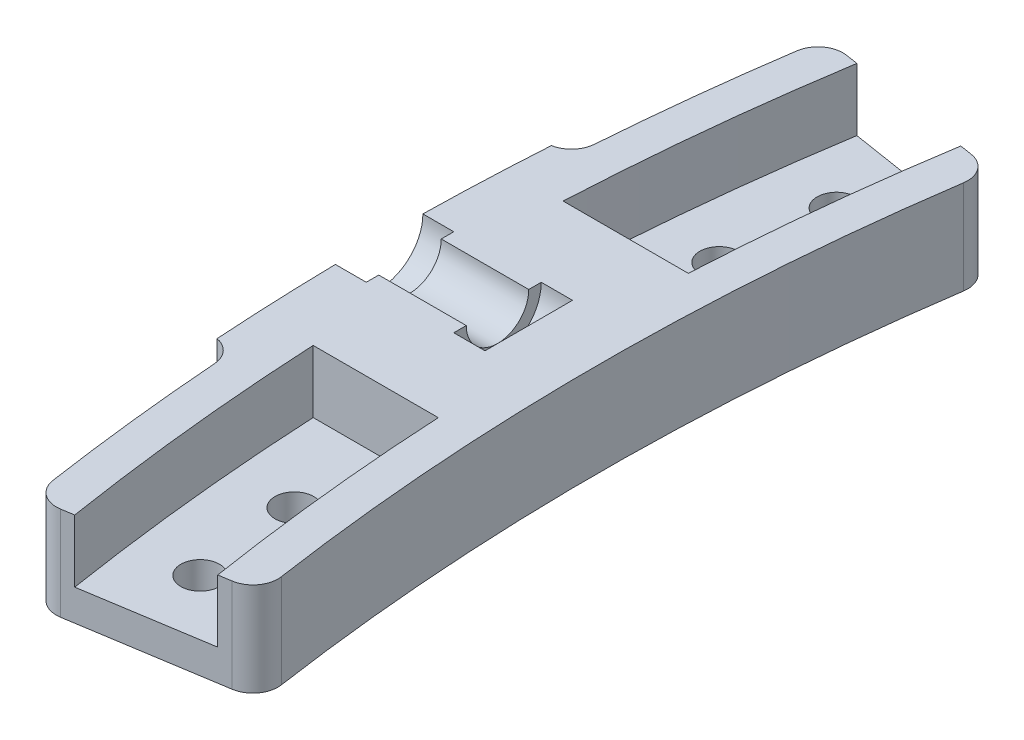
ISO-10303-21;
HEADER;
FILE_DESCRIPTION(('STEP AP214'),'2;1');
FILE_NAME('part.step','',(''),(''),'','','');
FILE_SCHEMA(('AUTOMOTIVE_DESIGN { 1 0 10303 214 1 1 1 1 }'));
ENDSEC;
DATA;
#1=APPLICATION_CONTEXT('core data for automotive mechanical design processes');
#2=APPLICATION_PROTOCOL_DEFINITION('international standard','automotive_design',2000,#1);
#3=PRODUCT_CONTEXT('',#1,'mechanical');
#4=PRODUCT('Part','Part','',(#3));
#5=PRODUCT_RELATED_PRODUCT_CATEGORY('part','',(#4));
#6=PRODUCT_DEFINITION_FORMATION('','',#4);
#7=PRODUCT_DEFINITION_CONTEXT('part definition',#1,'design');
#8=PRODUCT_DEFINITION('design','',#6,#7);
#9=PRODUCT_DEFINITION_SHAPE('','',#8);
#10=(LENGTH_UNIT() NAMED_UNIT(*) SI_UNIT(.MILLI.,.METRE.));
#11=(NAMED_UNIT(*) PLANE_ANGLE_UNIT() SI_UNIT($,.RADIAN.));
#12=(NAMED_UNIT(*) SI_UNIT($,.STERADIAN.) SOLID_ANGLE_UNIT());
#13=UNCERTAINTY_MEASURE_WITH_UNIT(LENGTH_MEASURE(1.E-05),#10,'distance_accuracy_value','');
#14=(GEOMETRIC_REPRESENTATION_CONTEXT(3) GLOBAL_UNCERTAINTY_ASSIGNED_CONTEXT((#13)) GLOBAL_UNIT_ASSIGNED_CONTEXT((#10,
#11,#12)) REPRESENTATION_CONTEXT('',''));
#15=CARTESIAN_POINT('',(0.,0.,0.));
#16=DIRECTION('',(0.,0.,1.));
#17=DIRECTION('',(1.,0.,0.));
#18=AXIS2_PLACEMENT_3D('',#15,#16,#17);
#19=CARTESIAN_POINT('',(0.,7.5,0.));
#20=DIRECTION('',(0.,1.,0.));
#21=DIRECTION('',(0.,0.,1.));
#22=AXIS2_PLACEMENT_3D('',#19,#20,#21);
#23=PLANE('',#22);
#24=DIRECTION('',(0.987688340595138,0.,0.156434465040232));
#25=VECTOR('',#24,1.);
#26=CARTESIAN_POINT('',(0.,7.5,0.));
#27=LINE('',#26,#25);
#28=CARTESIAN_POINT('',(-198.515528471673,7.5,-31.4417708727157));
#29=VERTEX_POINT('',#28);
#30=CARTESIAN_POINT('',(-197.537668119028,7.5,-31.2868930080464));
#31=VERTEX_POINT('',#30);
#32=EDGE_CURVE('E534',#29,#31,#27,.T.);
#33=ORIENTED_EDGE('',*,*,#32,.F.);
#34=CARTESIAN_POINT('',(-198.828397401754,7.5,-29.4663941915254));
#35=DIRECTION('',(0.,1.,0.));
#36=DIRECTION('',(0.,0.,1.));
#37=AXIS2_PLACEMENT_3D('',#34,#35,#36);
#38=CIRCLE('',#37,2.);
#39=CARTESIAN_POINT('',(-200.806789415701,7.5,-29.7595921436799));
#40=VERTEX_POINT('',#39);
#41=EDGE_CURVE('E394',#29,#40,#38,.T.);
#42=ORIENTED_EDGE('',*,*,#41,.T.);
#43=CARTESIAN_POINT('',(0.,7.5,0.));
#44=DIRECTION('',(0.,1.,0.));
#45=DIRECTION('',(0.,0.,1.));
#46=AXIS2_PLACEMENT_3D('',#43,#44,#45);
#47=CIRCLE('',#46,203.);
#48=CARTESIAN_POINT('',(-202.430732799715,7.5,-15.1920511508636));
#49=VERTEX_POINT('',#48);
#50=EDGE_CURVE('E537',#40,#49,#47,.T.);
#51=ORIENTED_EDGE('',*,*,#50,.T.);
#52=CARTESIAN_POINT('',(-204.42512425587,7.5,-15.3417265316603));
#53=DIRECTION('',(0.,1.,0.));
#54=DIRECTION('',(0.,0.,1.));
#55=AXIS2_PLACEMENT_3D('',#52,#53,#54);
#56=CIRCLE('',#55,2.);
#57=CARTESIAN_POINT('',(-204.062149802294,7.5,-13.3749399275643));
#58=VERTEX_POINT('',#57);
#59=EDGE_CURVE('E367',#49,#58,#56,.F.);
#60=ORIENTED_EDGE('',*,*,#59,.T.);
#61=CARTESIAN_POINT('',(0.,7.5,0.));
#62=DIRECTION('',(0.,1.,0.));
#63=DIRECTION('',(0.,0.,1.));
#64=AXIS2_PLACEMENT_3D('',#61,#62,#63);
#65=CIRCLE('',#64,204.5);
#66=CARTESIAN_POINT('',(-204.470046706113,7.5,-3.50000000000005));
#67=VERTEX_POINT('',#66);
#68=EDGE_CURVE('E430',#58,#67,#65,.T.);
#69=ORIENTED_EDGE('',*,*,#68,.T.);
#70=DIRECTION('',(-1.,0.,0.));
#71=VECTOR('',#70,1.);
#72=CARTESIAN_POINT('',(-202.,7.5,-3.50000000000005));
#73=LINE('',#72,#71);
#74=CARTESIAN_POINT('',(-202.,7.5,-3.50000000000005));
#75=VERTEX_POINT('',#74);
#76=EDGE_CURVE('E426',#67,#75,#73,.F.);
#77=ORIENTED_EDGE('',*,*,#76,.T.);
#78=DIRECTION('',(0.,0.,-1.));
#79=VECTOR('',#78,1.);
#80=CARTESIAN_POINT('',(-202.,7.5,0.));
#81=LINE('',#80,#79);
#82=CARTESIAN_POINT('',(-202.,7.5,-2.50000000000005));
#83=VERTEX_POINT('',#82);
#84=EDGE_CURVE('E222',#83,#75,#81,.T.);
#85=ORIENTED_EDGE('',*,*,#84,.F.);
#86=DIRECTION('',(1.,0.,0.));
#87=VECTOR('',#86,1.);
#88=CARTESIAN_POINT('',(-204.5,7.5,-2.50000000000005));
#89=LINE('',#88,#87);
#90=CARTESIAN_POINT('',(-195.,7.5,-2.50000000000005));
#91=VERTEX_POINT('',#90);
#92=EDGE_CURVE('E208',#91,#83,#89,.F.);
#93=ORIENTED_EDGE('',*,*,#92,.F.);
#94=DIRECTION('',(0.,0.,-1.));
#95=VECTOR('',#94,1.);
#96=CARTESIAN_POINT('',(-195.,7.5,0.));
#97=LINE('',#96,#95);
#98=CARTESIAN_POINT('',(-195.,7.5,-3.50000000000005));
#99=VERTEX_POINT('',#98);
#100=EDGE_CURVE('E219',#91,#99,#97,.T.);
#101=ORIENTED_EDGE('',*,*,#100,.T.);
#102=DIRECTION('',(1.,0.,0.));
#103=VECTOR('',#102,1.);
#104=CARTESIAN_POINT('',(-195.,7.5,-3.50000000000005));
#105=LINE('',#104,#103);
#106=CARTESIAN_POINT('',(-192.5,7.5,-3.50000000000005));
#107=VERTEX_POINT('',#106);
#108=EDGE_CURVE('E233',#107,#99,#105,.F.);
#109=ORIENTED_EDGE('',*,*,#108,.F.);
#110=DIRECTION('',(0.,0.,-1.));
#111=VECTOR('',#110,1.);
#112=CARTESIAN_POINT('',(-192.5,7.5,0.));
#113=LINE('',#112,#111);
#114=CARTESIAN_POINT('',(-192.5,7.5,3.49999999999995));
#115=VERTEX_POINT('',#114);
#116=EDGE_CURVE('E539',#115,#107,#113,.T.);
#117=ORIENTED_EDGE('',*,*,#116,.F.);
#118=DIRECTION('',(1.,0.,0.));
#119=VECTOR('',#118,1.);
#120=CARTESIAN_POINT('',(-195.,7.5,3.49999999999995));
#121=LINE('',#120,#119);
#122=CARTESIAN_POINT('',(-195.,7.5,3.49999999999995));
#123=VERTEX_POINT('',#122);
#124=EDGE_CURVE('E229',#123,#115,#121,.T.);
#125=ORIENTED_EDGE('',*,*,#124,.F.);
#126=CARTESIAN_POINT('',(-195.,7.5,2.49999999999995));
#127=VERTEX_POINT('',#126);
#128=EDGE_CURVE('E228',#123,#127,#97,.T.);
#129=ORIENTED_EDGE('',*,*,#128,.T.);
#130=DIRECTION('',(1.,0.,0.));
#131=VECTOR('',#130,1.);
#132=CARTESIAN_POINT('',(-204.5,7.5,2.49999999999995));
#133=LINE('',#132,#131);
#134=CARTESIAN_POINT('',(-202.,7.5,2.49999999999995));
#135=VERTEX_POINT('',#134);
#136=EDGE_CURVE('E211',#135,#127,#133,.T.);
#137=ORIENTED_EDGE('',*,*,#136,.F.);
#138=CARTESIAN_POINT('',(-202.,7.5,3.49999999999995));
#139=VERTEX_POINT('',#138);
#140=EDGE_CURVE('E244',#139,#135,#81,.T.);
#141=ORIENTED_EDGE('',*,*,#140,.F.);
#142=DIRECTION('',(-1.,0.,0.));
#143=VECTOR('',#142,1.);
#144=CARTESIAN_POINT('',(-202.,7.5,3.49999999999995));
#145=LINE('',#144,#143);
#146=CARTESIAN_POINT('',(-204.470046706113,7.5,3.49999999999995));
#147=VERTEX_POINT('',#146);
#148=EDGE_CURVE('E428',#139,#147,#145,.T.);
#149=ORIENTED_EDGE('',*,*,#148,.T.);
#150=CARTESIAN_POINT('',(-204.062149802294,7.5,13.3749399275643));
#151=VERTEX_POINT('',#150);
#152=EDGE_CURVE('E520',#147,#151,#65,.T.);
#153=ORIENTED_EDGE('',*,*,#152,.T.);
#154=CARTESIAN_POINT('',(-204.42512425587,7.5,15.3417265316613));
#155=DIRECTION('',(0.,1.,0.));
#156=DIRECTION('',(0.,0.,1.));
#157=AXIS2_PLACEMENT_3D('',#154,#155,#156);
#158=CIRCLE('',#157,2.);
#159=CARTESIAN_POINT('',(-202.430732799715,7.5,15.1920511508646));
#160=VERTEX_POINT('',#159);
#161=EDGE_CURVE('E11',#151,#160,#158,.F.);
#162=ORIENTED_EDGE('',*,*,#161,.T.);
#163=CARTESIAN_POINT('',(-200.806789415701,7.5,29.7595921436798));
#164=VERTEX_POINT('',#163);
#165=EDGE_CURVE('E536',#160,#164,#47,.T.);
#166=ORIENTED_EDGE('',*,*,#165,.T.);
#167=CARTESIAN_POINT('',(-198.828397401754,7.5,29.4663941915253));
#168=DIRECTION('',(0.,1.,0.));
#169=DIRECTION('',(0.,0.,1.));
#170=AXIS2_PLACEMENT_3D('',#167,#168,#169);
#171=CIRCLE('',#170,2.);
#172=CARTESIAN_POINT('',(-198.515528471673,7.5,31.4417708727156));
#173=VERTEX_POINT('',#172);
#174=EDGE_CURVE('E400',#164,#173,#171,.T.);
#175=ORIENTED_EDGE('',*,*,#174,.T.);
#176=DIRECTION('',(-0.987688340595138,0.,0.156434465040231));
#177=VECTOR('',#176,1.);
#178=CARTESIAN_POINT('',(0.,7.5,0.));
#179=LINE('',#178,#177);
#180=CARTESIAN_POINT('',(-197.537668119028,7.5,31.2868930080463));
#181=VERTEX_POINT('',#180);
#182=EDGE_CURVE('E530',#181,#173,#179,.T.);
#183=ORIENTED_EDGE('',*,*,#182,.F.);
#184=CARTESIAN_POINT('',(0.,7.5,0.));
#185=DIRECTION('',(0.,1.,0.));
#186=DIRECTION('',(0.,0.,1.));
#187=AXIS2_PLACEMENT_3D('',#184,#185,#186);
#188=CIRCLE('',#187,200.);
#189=CARTESIAN_POINT('',(-199.749843554382,7.5,10.));
#190=VERTEX_POINT('',#189);
#191=EDGE_CURVE('E506',#190,#181,#188,.T.);
#192=ORIENTED_EDGE('',*,*,#191,.F.);
#193=DIRECTION('',(-1.,0.,0.));
#194=VECTOR('',#193,1.);
#195=CARTESIAN_POINT('',(0.,7.5,10.));
#196=LINE('',#195,#194);
#197=CARTESIAN_POINT('',(-189.736659610103,7.5,10.));
#198=VERTEX_POINT('',#197);
#199=EDGE_CURVE('E460',#198,#190,#196,.T.);
#200=ORIENTED_EDGE('',*,*,#199,.F.);
#201=CARTESIAN_POINT('',(0.,7.5,0.));
#202=DIRECTION('',(0.,1.,0.));
#203=DIRECTION('',(0.,0.,1.));
#204=AXIS2_PLACEMENT_3D('',#201,#202,#203);
#205=CIRCLE('',#204,190.);
#206=CARTESIAN_POINT('',(-187.660784713076,7.5,29.7225483576439));
#207=VERTEX_POINT('',#206);
#208=EDGE_CURVE('E496',#198,#207,#205,.T.);
#209=ORIENTED_EDGE('',*,*,#208,.T.);
#210=CARTESIAN_POINT('',(-186.662644351399,7.5,29.5644584550944));
#211=VERTEX_POINT('',#210);
#212=EDGE_CURVE('E527',#211,#207,#179,.T.);
#213=ORIENTED_EDGE('',*,*,#212,.F.);
#214=CARTESIAN_POINT('',(-186.97551328148,7.5,27.5890817739042));
#215=DIRECTION('',(0.,1.,0.));
#216=DIRECTION('',(0.,0.,1.));
#217=AXIS2_PLACEMENT_3D('',#214,#215,#216);
#218=CIRCLE('',#217,2.);
#219=CARTESIAN_POINT('',(-184.996936421358,7.5,27.2971338186247));
#220=VERTEX_POINT('',#219);
#221=EDGE_CURVE('E398',#211,#220,#218,.T.);
#222=ORIENTED_EDGE('',*,*,#221,.T.);
#223=CARTESIAN_POINT('',(0.,7.5,0.));
#224=DIRECTION('',(0.,1.,0.));
#225=DIRECTION('',(0.,0.,1.));
#226=AXIS2_PLACEMENT_3D('',#223,#224,#225);
#227=CIRCLE('',#226,187.);
#228=CARTESIAN_POINT('',(-184.996936421358,7.5,-27.2971338186249));
#229=VERTEX_POINT('',#228);
#230=EDGE_CURVE('E529',#229,#220,#227,.T.);
#231=ORIENTED_EDGE('',*,*,#230,.F.);
#232=CARTESIAN_POINT('',(-186.97551328148,7.5,-27.5890817739043));
#233=DIRECTION('',(0.,1.,0.));
#234=DIRECTION('',(0.,0.,1.));
#235=AXIS2_PLACEMENT_3D('',#232,#233,#234);
#236=CIRCLE('',#235,2.);
#237=CARTESIAN_POINT('',(-186.662644351399,7.5,-29.5644584550946));
#238=VERTEX_POINT('',#237);
#239=EDGE_CURVE('E396',#229,#238,#236,.T.);
#240=ORIENTED_EDGE('',*,*,#239,.T.);
#241=CARTESIAN_POINT('',(-187.660784713076,7.5,-29.7225483576441));
#242=VERTEX_POINT('',#241);
#243=EDGE_CURVE('E533',#242,#238,#27,.T.);
#244=ORIENTED_EDGE('',*,*,#243,.F.);
#245=CARTESIAN_POINT('',(0.,7.5,0.));
#246=DIRECTION('',(0.,1.,0.));
#247=DIRECTION('',(0.,0.,1.));
#248=AXIS2_PLACEMENT_3D('',#245,#246,#247);
#249=CIRCLE('',#248,190.);
#250=CARTESIAN_POINT('',(-189.736659610103,7.5,-9.99999999999999));
#251=VERTEX_POINT('',#250);
#252=EDGE_CURVE('E465',#242,#251,#249,.T.);
#253=ORIENTED_EDGE('',*,*,#252,.T.);
#254=DIRECTION('',(-1.,0.,0.));
#255=VECTOR('',#254,1.);
#256=CARTESIAN_POINT('',(0.,7.5,-10.));
#257=LINE('',#256,#255);
#258=CARTESIAN_POINT('',(-199.749843554382,7.5,-9.99999999999999));
#259=VERTEX_POINT('',#258);
#260=EDGE_CURVE('E476',#251,#259,#257,.T.);
#261=ORIENTED_EDGE('',*,*,#260,.T.);
#262=CARTESIAN_POINT('',(0.,7.5,0.));
#263=DIRECTION('',(0.,1.,0.));
#264=DIRECTION('',(0.,0.,1.));
#265=AXIS2_PLACEMENT_3D('',#262,#263,#264);
#266=CIRCLE('',#265,200.);
#267=EDGE_CURVE('E473',#31,#259,#266,.T.);
#268=ORIENTED_EDGE('',*,*,#267,.F.);
#269=EDGE_LOOP('',(#33,#42,#51,#60,#69,#77,#85,#93,#101,#109,#117,#125,#129,#137,#141,#149,#153,
#162,#166,#175,#183,#192,#200,#209,#213,#222,#231,#240,#244,#253,#261,#268));
#270=FACE_BOUND('',#269,.T.);
#271=ADVANCED_FACE('F35',(#270),#23,.T.);
#272=CARTESIAN_POINT('',(0.,7.5,0.));
#273=DIRECTION('',(0.,-1.,0.));
#274=DIRECTION('',(0.,0.,-1.));
#275=AXIS2_PLACEMENT_3D('',#272,#273,#274);
#276=CYLINDRICAL_SURFACE('',#275,204.5);
#277=CARTESIAN_POINT('',(-204.470046706113,7.5,-3.50000000000005));
#278=CARTESIAN_POINT('',(-204.470046015007,7.40156709085116,-3.50000943880891));
#279=CARTESIAN_POINT('',(-204.470117770848,7.3031386646568,-3.49584758938259));
#280=CARTESIAN_POINT('',(-204.470401073582,7.10698614676135,-3.47925436424628));
#281=CARTESIAN_POINT('',(-204.470612613706,7.0092620211873,-3.46682338895473));
#282=CARTESIAN_POINT('',(-204.471170185432,6.81527257182049,-3.43377666337935));
#283=CARTESIAN_POINT('',(-204.471516121615,6.71900626325566,-3.41316671989991));
#284=CARTESIAN_POINT('',(-204.472332063616,6.52857582386149,-3.36392937343361));
#285=CARTESIAN_POINT('',(-204.47280206794,6.43441166774297,-3.33530206695291));
#286=CARTESIAN_POINT('',(-204.474380018944,6.15598448276347,-3.23762675794605));
#287=CARTESIAN_POINT('',(-204.475656157778,5.97570405684611,-3.15677120548821));
#288=CARTESIAN_POINT('',(-204.478512008007,5.63141229218133,-2.96600108409679));
#289=CARTESIAN_POINT('',(-204.480091660416,5.46739780167807,-2.85609215985401));
#290=CARTESIAN_POINT('',(-204.483377091486,5.16010021526627,-2.61028016583723));
#291=CARTESIAN_POINT('',(-204.485082884414,5.01681946973034,-2.47437415308749));
#292=CARTESIAN_POINT('',(-204.488428368234,4.75509231999566,-2.18041839537237));
#293=CARTESIAN_POINT('',(-204.49006804902,4.63664970091344,-2.02236528149283));
#294=CARTESIAN_POINT('',(-204.493096216476,4.42797730159888,-1.68861132589826));
#295=CARTESIAN_POINT('',(-204.49448469881,4.33774800826972,-1.51291017968411));
#296=CARTESIAN_POINT('',(-204.496853800962,4.18807499228072,-1.14886219597997));
#297=CARTESIAN_POINT('',(-204.497834447116,4.12862928178693,-0.960516175913655));
#298=CARTESIAN_POINT('',(-204.499277386115,4.04220620697506,-0.576530368187154));
#299=CARTESIAN_POINT('',(-204.499739719827,4.01522628293847,-0.380891156802305));
#300=CARTESIAN_POINT('',(-204.500094053087,3.99449287351828,0.0121449996524284));
#301=CARTESIAN_POINT('',(-204.499986039929,4.00074012837864,0.209541983784637));
#302=CARTESIAN_POINT('',(-204.499211873441,4.04628253942889,0.600461854794114));
#303=CARTESIAN_POINT('',(-204.498545784139,4.0855739044305,0.793985183492657));
#304=CARTESIAN_POINT('',(-204.496730631579,4.19608326672358,1.17168763620416));
#305=CARTESIAN_POINT('',(-204.495581569682,4.26730117390768,1.35586678658787));
#306=CARTESIAN_POINT('',(-204.49292986953,4.43964795573392,1.70966917689119));
#307=CARTESIAN_POINT('',(-204.491427203204,4.54077920512749,1.87929125977886));
#308=CARTESIAN_POINT('',(-204.488237790151,4.77007516054438,2.19914250229239));
#309=CARTESIAN_POINT('',(-204.48655105231,4.89823856202203,2.34937259719317));
#310=CARTESIAN_POINT('',(-204.483183536994,5.17796107182609,2.62618666325573));
#311=CARTESIAN_POINT('',(-204.481502759484,5.32952004154845,2.75277077449529));
#312=CARTESIAN_POINT('',(-204.478336097599,5.65179883449802,2.97873880159179));
#313=CARTESIAN_POINT('',(-204.476850275261,5.82252472493159,3.07811407018099));
#314=CARTESIAN_POINT('',(-204.474240904141,6.17831258593119,3.24683835771934));
#315=CARTESIAN_POINT('',(-204.473117577074,6.36338324471376,3.31616900930716));
#316=CARTESIAN_POINT('',(-204.471362852181,6.74239566531391,3.42266818702435));
#317=CARTESIAN_POINT('',(-204.470730703331,6.93632340174938,3.45988582445775));
#318=CARTESIAN_POINT('',(-204.470267957678,7.19295126295407,3.48705221838691));
#319=CARTESIAN_POINT('',(-204.47018503069,7.25431447039849,3.49191019785082));
#320=CARTESIAN_POINT('',(-204.470074478895,7.37711016371178,3.49837965658393));
#321=CARTESIAN_POINT('',(-204.470046762857,7.43854236717568,3.49999649163529));
#322=CARTESIAN_POINT('',(-204.470046706113,7.5,3.49999999999995));
#323=B_SPLINE_CURVE_WITH_KNOTS('',3,(#277,#278,#279,#280,#281,#282,#283,#284,#285,#286,#287,
#288,#289,#290,#291,#292,#293,#294,#295,#296,#297,#298,#299,#300,#301,#302,#303,#304,#305,#306,
#307,#308,#309,#310,#311,#312,#313,#314,#315,#316,#317,#318,#319,#320,#321,#322),.UNSPECIFIED.,
.F.,.F.,(4,2,2,2,2,2,2,2,2,2,2,2,2,2,2,2,2,2,2,2,2,2,4),(0.,0.29520266530573,0.590391036962056,
0.8853702082295,1.18034582894221,1.77004858658914,2.35963685679118,2.94929191031539,
3.53903675699568,4.12879178088056,4.71850871688937,5.30817915446261,5.89786272892642,
6.48747865755245,7.07709292209594,7.66675400732817,8.25638664259122,8.84601578478512,
9.43583210062764,10.0260084855921,10.6152806898831,10.7998867711548,10.9841875504903),.UNSPECIFIED.);
#324=EDGE_CURVE('E231',#67,#147,#323,.T.);
#325=ORIENTED_EDGE('',*,*,#324,.F.);
#326=ORIENTED_EDGE('',*,*,#68,.F.);
#327=DIRECTION('',(0.,-1.,0.));
#328=VECTOR('',#327,1.);
#329=CARTESIAN_POINT('',(-204.062149802294,7.5,-13.3749399275643));
#330=LINE('',#329,#328);
#331=CARTESIAN_POINT('',(-204.062149802294,0.,-13.3749399275643));
#332=VERTEX_POINT('',#331);
#333=EDGE_CURVE('E370',#58,#332,#330,.T.);
#334=ORIENTED_EDGE('',*,*,#333,.T.);
#335=CARTESIAN_POINT('',(0.,0.,0.));
#336=DIRECTION('',(0.,1.,0.));
#337=DIRECTION('',(0.,0.,1.));
#338=AXIS2_PLACEMENT_3D('',#335,#336,#337);
#339=CIRCLE('',#338,204.5);
#340=CARTESIAN_POINT('',(-204.062149802294,0.,13.3749399275643));
#341=VERTEX_POINT('',#340);
#342=EDGE_CURVE('E485',#332,#341,#339,.T.);
#343=ORIENTED_EDGE('',*,*,#342,.T.);
#344=DIRECTION('',(0.,-1.,0.));
#345=VECTOR('',#344,1.);
#346=CARTESIAN_POINT('',(-204.062149802294,7.5,13.3749399275643));
#347=LINE('',#346,#345);
#348=EDGE_CURVE('E524',#151,#341,#347,.T.);
#349=ORIENTED_EDGE('',*,*,#348,.F.);
#350=ORIENTED_EDGE('',*,*,#152,.F.);
#351=EDGE_LOOP('',(#325,#326,#334,#343,#349,#350));
#352=FACE_BOUND('',#351,.T.);
#353=ADVANCED_FACE('F246',(#352),#276,.T.);
#354=CARTESIAN_POINT('',(0.,7.5,0.));
#355=DIRECTION('',(0.156434465040231,0.,0.987688340595138));
#356=DIRECTION('',(0.987688340595138,0.,-0.156434465040231));
#357=AXIS2_PLACEMENT_3D('',#354,#355,#356);
#358=PLANE('',#357);
#359=DIRECTION('',(-0.987688340595138,0.,0.156434465040231));
#360=VECTOR('',#359,1.);
#361=CARTESIAN_POINT('',(0.,0.,0.));
#362=LINE('',#361,#360);
#363=CARTESIAN_POINT('',(-186.662644351399,0.,29.5644584550944));
#364=VERTEX_POINT('',#363);
#365=CARTESIAN_POINT('',(-198.515528471673,0.,31.4417708727156));
#366=VERTEX_POINT('',#365);
#367=EDGE_CURVE('E526',#364,#366,#362,.T.);
#368=ORIENTED_EDGE('',*,*,#367,.F.);
#369=DIRECTION('',(0.,-1.,0.));
#370=VECTOR('',#369,1.);
#371=CARTESIAN_POINT('',(-186.662644351399,7.5,29.5644584550944));
#372=LINE('',#371,#370);
#373=EDGE_CURVE('E384',#364,#211,#372,.F.);
#374=ORIENTED_EDGE('',*,*,#373,.T.);
#375=ORIENTED_EDGE('',*,*,#212,.T.);
#376=DIRECTION('',(0.,1.,0.));
#377=VECTOR('',#376,1.);
#378=CARTESIAN_POINT('',(-187.660784713076,2.5,29.7225483576439));
#379=LINE('',#378,#377);
#380=CARTESIAN_POINT('',(-187.660784713076,2.5,29.7225483576439));
#381=VERTEX_POINT('',#380);
#382=EDGE_CURVE('E511',#381,#207,#379,.T.);
#383=ORIENTED_EDGE('',*,*,#382,.F.);
#384=DIRECTION('',(0.987688340595138,0.,-0.156434465040231));
#385=VECTOR('',#384,1.);
#386=CARTESIAN_POINT('',(0.,2.5,0.));
#387=LINE('',#386,#385);
#388=CARTESIAN_POINT('',(-197.537668119028,2.5,31.2868930080463));
#389=VERTEX_POINT('',#388);
#390=EDGE_CURVE('E499',#389,#381,#387,.T.);
#391=ORIENTED_EDGE('',*,*,#390,.F.);
#392=DIRECTION('',(0.,1.,0.));
#393=VECTOR('',#392,1.);
#394=CARTESIAN_POINT('',(-197.537668119028,2.5,31.2868930080463));
#395=LINE('',#394,#393);
#396=EDGE_CURVE('E514',#389,#181,#395,.T.);
#397=ORIENTED_EDGE('',*,*,#396,.T.);
#398=ORIENTED_EDGE('',*,*,#182,.T.);
#399=DIRECTION('',(0.,1.,0.));
#400=VECTOR('',#399,1.);
#401=CARTESIAN_POINT('',(-198.515528471673,0.,31.4417708727156));
#402=LINE('',#401,#400);
#403=EDGE_CURVE('E386',#173,#366,#402,.F.);
#404=ORIENTED_EDGE('',*,*,#403,.T.);
#405=EDGE_LOOP('',(#368,#374,#375,#383,#391,#397,#398,#404));
#406=FACE_BOUND('',#405,.T.);
#407=ADVANCED_FACE('F325',(#406),#358,.T.);
#408=CARTESIAN_POINT('',(0.,7.5,0.));
#409=DIRECTION('',(0.156434465040232,0.,-0.987688340595138));
#410=DIRECTION('',(-0.987688340595138,0.,-0.156434465040232));
#411=AXIS2_PLACEMENT_3D('',#408,#409,#410);
#412=PLANE('',#411);
#413=DIRECTION('',(0.987688340595138,0.,0.156434465040232));
#414=VECTOR('',#413,1.);
#415=CARTESIAN_POINT('',(0.,0.,0.));
#416=LINE('',#415,#414);
#417=CARTESIAN_POINT('',(-198.515528471673,0.,-31.4417708727157));
#418=VERTEX_POINT('',#417);
#419=CARTESIAN_POINT('',(-186.662644351399,0.,-29.5644584550946));
#420=VERTEX_POINT('',#419);
#421=EDGE_CURVE('E545',#418,#420,#416,.T.);
#422=ORIENTED_EDGE('',*,*,#421,.F.);
#423=DIRECTION('',(0.,1.,0.));
#424=VECTOR('',#423,1.);
#425=CARTESIAN_POINT('',(-198.515528471673,7.5,-31.4417708727157));
#426=LINE('',#425,#424);
#427=EDGE_CURVE('E402',#418,#29,#426,.T.);
#428=ORIENTED_EDGE('',*,*,#427,.T.);
#429=ORIENTED_EDGE('',*,*,#32,.T.);
#430=DIRECTION('',(0.,1.,0.));
#431=VECTOR('',#430,1.);
#432=CARTESIAN_POINT('',(-197.537668119028,2.5,-31.2868930080464));
#433=LINE('',#432,#431);
#434=CARTESIAN_POINT('',(-197.537668119028,2.5,-31.2868930080464));
#435=VERTEX_POINT('',#434);
#436=EDGE_CURVE('E472',#435,#31,#433,.T.);
#437=ORIENTED_EDGE('',*,*,#436,.F.);
#438=DIRECTION('',(-0.987688340595138,0.,-0.156434465040232));
#439=VECTOR('',#438,1.);
#440=CARTESIAN_POINT('',(0.,2.5,0.));
#441=LINE('',#440,#439);
#442=CARTESIAN_POINT('',(-187.660784713076,2.5,-29.7225483576441));
#443=VERTEX_POINT('',#442);
#444=EDGE_CURVE('E461',#443,#435,#441,.T.);
#445=ORIENTED_EDGE('',*,*,#444,.F.);
#446=DIRECTION('',(0.,1.,0.));
#447=VECTOR('',#446,1.);
#448=CARTESIAN_POINT('',(-187.660784713076,2.5,-29.7225483576441));
#449=LINE('',#448,#447);
#450=EDGE_CURVE('E482',#443,#242,#449,.T.);
#451=ORIENTED_EDGE('',*,*,#450,.T.);
#452=ORIENTED_EDGE('',*,*,#243,.T.);
#453=DIRECTION('',(0.,-1.,0.));
#454=VECTOR('',#453,1.);
#455=CARTESIAN_POINT('',(-186.662644351399,7.5,-29.5644584550946));
#456=LINE('',#455,#454);
#457=EDGE_CURVE('E404',#238,#420,#456,.T.);
#458=ORIENTED_EDGE('',*,*,#457,.T.);
#459=EDGE_LOOP('',(#422,#428,#429,#437,#445,#451,#452,#458));
#460=FACE_BOUND('',#459,.T.);
#461=ADVANCED_FACE('F332',(#460),#412,.T.);
#462=CARTESIAN_POINT('',(0.,7.5,0.));
#463=DIRECTION('',(0.,-1.,0.));
#464=DIRECTION('',(0.,0.,-1.));
#465=AXIS2_PLACEMENT_3D('',#462,#463,#464);
#466=CYLINDRICAL_SURFACE('',#465,203.);
#467=ORIENTED_EDGE('',*,*,#165,.F.);
#468=DIRECTION('',(0.,-1.,0.));
#469=VECTOR('',#468,1.);
#470=CARTESIAN_POINT('',(-202.430732799715,7.5,15.1920511508646));
#471=LINE('',#470,#469);
#472=CARTESIAN_POINT('',(-202.430732799715,0.,15.1920511508646));
#473=VERTEX_POINT('',#472);
#474=EDGE_CURVE('E376',#160,#473,#471,.T.);
#475=ORIENTED_EDGE('',*,*,#474,.T.);
#476=CARTESIAN_POINT('',(0.,0.,0.));
#477=DIRECTION('',(0.,1.,0.));
#478=DIRECTION('',(0.,0.,1.));
#479=AXIS2_PLACEMENT_3D('',#476,#477,#478);
#480=CIRCLE('',#479,203.);
#481=CARTESIAN_POINT('',(-200.806789415701,0.,29.7595921436798));
#482=VERTEX_POINT('',#481);
#483=EDGE_CURVE('E548',#473,#482,#480,.T.);
#484=ORIENTED_EDGE('',*,*,#483,.T.);
#485=DIRECTION('',(0.,-1.,0.));
#486=VECTOR('',#485,1.);
#487=CARTESIAN_POINT('',(-200.806789415701,7.5,29.7595921436798));
#488=LINE('',#487,#486);
#489=EDGE_CURVE('E381',#482,#164,#488,.F.);
#490=ORIENTED_EDGE('',*,*,#489,.T.);
#491=EDGE_LOOP('',(#467,#475,#484,#490));
#492=FACE_BOUND('',#491,.T.);
#493=ADVANCED_FACE('F328',(#492),#466,.T.);
#494=CARTESIAN_POINT('',(-200.806789415701,0.,-29.7595921436799));
#495=VERTEX_POINT('',#494);
#496=CARTESIAN_POINT('',(-202.430732799715,0.,-15.1920511508636));
#497=VERTEX_POINT('',#496);
#498=EDGE_CURVE('E549',#495,#497,#480,.T.);
#499=ORIENTED_EDGE('',*,*,#498,.T.);
#500=DIRECTION('',(0.,-1.,0.));
#501=VECTOR('',#500,1.);
#502=CARTESIAN_POINT('',(-202.430732799715,7.5,-15.1920511508636));
#503=LINE('',#502,#501);
#504=EDGE_CURVE('E368',#497,#49,#503,.F.);
#505=ORIENTED_EDGE('',*,*,#504,.T.);
#506=ORIENTED_EDGE('',*,*,#50,.F.);
#507=DIRECTION('',(0.,-1.,0.));
#508=VECTOR('',#507,1.);
#509=CARTESIAN_POINT('',(-200.806789415701,7.5,-29.7595921436799));
#510=LINE('',#509,#508);
#511=EDGE_CURVE('E416',#40,#495,#510,.T.);
#512=ORIENTED_EDGE('',*,*,#511,.T.);
#513=EDGE_LOOP('',(#499,#505,#506,#512));
#514=FACE_BOUND('',#513,.T.);
#515=ADVANCED_FACE('F331',(#514),#466,.T.);
#516=CARTESIAN_POINT('',(0.,7.5,0.));
#517=DIRECTION('',(0.,-1.,0.));
#518=DIRECTION('',(0.,0.,-1.));
#519=AXIS2_PLACEMENT_3D('',#516,#517,#518);
#520=CYLINDRICAL_SURFACE('',#519,187.);
#521=CARTESIAN_POINT('',(0.,0.,0.));
#522=DIRECTION('',(0.,1.,0.));
#523=DIRECTION('',(0.,0.,1.));
#524=AXIS2_PLACEMENT_3D('',#521,#522,#523);
#525=CIRCLE('',#524,187.);
#526=CARTESIAN_POINT('',(-184.996936421358,0.,-27.2971338186249));
#527=VERTEX_POINT('',#526);
#528=CARTESIAN_POINT('',(-184.996936421358,0.,27.2971338186247));
#529=VERTEX_POINT('',#528);
#530=EDGE_CURVE('E542',#527,#529,#525,.T.);
#531=ORIENTED_EDGE('',*,*,#530,.F.);
#532=DIRECTION('',(0.,-1.,0.));
#533=VECTOR('',#532,1.);
#534=CARTESIAN_POINT('',(-184.996936421358,7.5,-27.2971338186249));
#535=LINE('',#534,#533);
#536=EDGE_CURVE('E389',#527,#229,#535,.F.);
#537=ORIENTED_EDGE('',*,*,#536,.T.);
#538=ORIENTED_EDGE('',*,*,#230,.T.);
#539=DIRECTION('',(0.,-1.,0.));
#540=VECTOR('',#539,1.);
#541=CARTESIAN_POINT('',(-184.996936421358,7.5,27.2971338186247));
#542=LINE('',#541,#540);
#543=EDGE_CURVE('E391',#220,#529,#542,.T.);
#544=ORIENTED_EDGE('',*,*,#543,.T.);
#545=EDGE_LOOP('',(#531,#537,#538,#544));
#546=FACE_BOUND('',#545,.T.);
#547=ADVANCED_FACE('F318',(#546),#520,.F.);
#548=CARTESIAN_POINT('',(0.,0.,0.));
#549=DIRECTION('',(0.,1.,0.));
#550=DIRECTION('',(0.,0.,1.));
#551=AXIS2_PLACEMENT_3D('',#548,#549,#550);
#552=PLANE('',#551);
#553=CARTESIAN_POINT('',(-193.331747967893,0.,25.4526074829103));
#554=DIRECTION('',(0.,-1.,0.));
#555=DIRECTION('',(0.,0.,-1.));
#556=AXIS2_PLACEMENT_3D('',#553,#554,#555);
#557=CIRCLE('',#556,1.55);
#558=CARTESIAN_POINT('',(-193.331747967893,0.,23.9026074829103));
#559=VERTEX_POINT('',#558);
#560=EDGE_CURVE('E437',#559,#559,#557,.T.);
#561=ORIENTED_EDGE('',*,*,#560,.F.);
#562=EDGE_LOOP('',(#561));
#563=FACE_BOUND('',#562,.T.);
#564=CARTESIAN_POINT('',(-194.25796612789,0.,16.9953698357934));
#565=DIRECTION('',(0.,-1.,0.));
#566=DIRECTION('',(0.,0.,-1.));
#567=AXIS2_PLACEMENT_3D('',#564,#565,#566);
#568=CIRCLE('',#567,1.55);
#569=CARTESIAN_POINT('',(-194.25796612789,0.,15.4453698357934));
#570=VERTEX_POINT('',#569);
#571=EDGE_CURVE('E442',#570,#570,#568,.T.);
#572=ORIENTED_EDGE('',*,*,#571,.F.);
#573=EDGE_LOOP('',(#572));
#574=FACE_BOUND('',#573,.T.);
#575=CARTESIAN_POINT('',(-194.25796612789,0.,-16.9953698357934));
#576=DIRECTION('',(0.,-1.,0.));
#577=DIRECTION('',(0.,0.,-1.));
#578=AXIS2_PLACEMENT_3D('',#575,#576,#577);
#579=CIRCLE('',#578,1.55);
#580=CARTESIAN_POINT('',(-194.25796612789,0.,-18.5453698357934));
#581=VERTEX_POINT('',#580);
#582=EDGE_CURVE('E448',#581,#581,#579,.T.);
#583=ORIENTED_EDGE('',*,*,#582,.F.);
#584=EDGE_LOOP('',(#583));
#585=FACE_BOUND('',#584,.T.);
#586=CARTESIAN_POINT('',(-193.331747967893,0.,-25.4526074829103));
#587=DIRECTION('',(0.,-1.,0.));
#588=DIRECTION('',(0.,0.,-1.));
#589=AXIS2_PLACEMENT_3D('',#586,#587,#588);
#590=CIRCLE('',#589,1.55);
#591=CARTESIAN_POINT('',(-193.331747967893,0.,-27.0026074829102));
#592=VERTEX_POINT('',#591);
#593=EDGE_CURVE('E454',#592,#592,#590,.T.);
#594=ORIENTED_EDGE('',*,*,#593,.F.);
#595=EDGE_LOOP('',(#594));
#596=FACE_BOUND('',#595,.T.);
#597=ORIENTED_EDGE('',*,*,#498,.F.);
#598=CARTESIAN_POINT('',(-198.828397401754,0.,-29.4663941915254));
#599=DIRECTION('',(0.,1.,0.));
#600=DIRECTION('',(0.,0.,1.));
#601=AXIS2_PLACEMENT_3D('',#598,#599,#600);
#602=CIRCLE('',#601,2.);
#603=EDGE_CURVE('E407',#495,#418,#602,.F.);
#604=ORIENTED_EDGE('',*,*,#603,.T.);
#605=ORIENTED_EDGE('',*,*,#421,.T.);
#606=CARTESIAN_POINT('',(-186.97551328148,0.,-27.5890817739043));
#607=DIRECTION('',(0.,1.,0.));
#608=DIRECTION('',(0.,0.,1.));
#609=AXIS2_PLACEMENT_3D('',#606,#607,#608);
#610=CIRCLE('',#609,2.);
#611=EDGE_CURVE('E409',#420,#527,#610,.F.);
#612=ORIENTED_EDGE('',*,*,#611,.T.);
#613=ORIENTED_EDGE('',*,*,#530,.T.);
#614=CARTESIAN_POINT('',(-186.97551328148,0.,27.5890817739042));
#615=DIRECTION('',(0.,1.,0.));
#616=DIRECTION('',(0.,0.,1.));
#617=AXIS2_PLACEMENT_3D('',#614,#615,#616);
#618=CIRCLE('',#617,2.);
#619=EDGE_CURVE('E411',#529,#364,#618,.F.);
#620=ORIENTED_EDGE('',*,*,#619,.T.);
#621=ORIENTED_EDGE('',*,*,#367,.T.);
#622=CARTESIAN_POINT('',(-198.828397401754,0.,29.4663941915253));
#623=DIRECTION('',(0.,1.,0.));
#624=DIRECTION('',(0.,0.,1.));
#625=AXIS2_PLACEMENT_3D('',#622,#623,#624);
#626=CIRCLE('',#625,2.);
#627=EDGE_CURVE('E413',#366,#482,#626,.F.);
#628=ORIENTED_EDGE('',*,*,#627,.T.);
#629=ORIENTED_EDGE('',*,*,#483,.F.);
#630=CARTESIAN_POINT('',(-204.42512425587,0.,15.3417265316613));
#631=DIRECTION('',(0.,1.,0.));
#632=DIRECTION('',(0.,0.,1.));
#633=AXIS2_PLACEMENT_3D('',#630,#631,#632);
#634=CIRCLE('',#633,2.);
#635=EDGE_CURVE('E43',#473,#341,#634,.T.);
#636=ORIENTED_EDGE('',*,*,#635,.T.);
#637=ORIENTED_EDGE('',*,*,#342,.F.);
#638=CARTESIAN_POINT('',(-204.42512425587,0.,-15.3417265316603));
#639=DIRECTION('',(0.,1.,0.));
#640=DIRECTION('',(0.,0.,1.));
#641=AXIS2_PLACEMENT_3D('',#638,#639,#640);
#642=CIRCLE('',#641,2.);
#643=EDGE_CURVE('E374',#332,#497,#642,.T.);
#644=ORIENTED_EDGE('',*,*,#643,.T.);
#645=EDGE_LOOP('',(#597,#604,#605,#612,#613,#620,#621,#628,#629,#636,#637,#644));
#646=FACE_BOUND('',#645,.T.);
#647=ADVANCED_FACE('F313',(#563,#574,#585,#596,#646),#552,.F.);
#648=CARTESIAN_POINT('',(0.,2.5,10.));
#649=DIRECTION('',(0.,0.,-1.));
#650=DIRECTION('',(-1.,0.,0.));
#651=AXIS2_PLACEMENT_3D('',#648,#649,#650);
#652=PLANE('',#651);
#653=ORIENTED_EDGE('',*,*,#199,.T.);
#654=DIRECTION('',(0.,1.,0.));
#655=VECTOR('',#654,1.);
#656=CARTESIAN_POINT('',(-199.749843554382,2.5,10.));
#657=LINE('',#656,#655);
#658=CARTESIAN_POINT('',(-199.749843554382,2.5,10.));
#659=VERTEX_POINT('',#658);
#660=EDGE_CURVE('E504',#659,#190,#657,.T.);
#661=ORIENTED_EDGE('',*,*,#660,.F.);
#662=DIRECTION('',(-1.,0.,0.));
#663=VECTOR('',#662,1.);
#664=CARTESIAN_POINT('',(0.,2.5,10.));
#665=LINE('',#664,#663);
#666=CARTESIAN_POINT('',(-189.736659610103,2.5,10.));
#667=VERTEX_POINT('',#666);
#668=EDGE_CURVE('E492',#667,#659,#665,.T.);
#669=ORIENTED_EDGE('',*,*,#668,.F.);
#670=DIRECTION('',(0.,1.,0.));
#671=VECTOR('',#670,1.);
#672=CARTESIAN_POINT('',(-189.736659610103,2.5,10.));
#673=LINE('',#672,#671);
#674=EDGE_CURVE('E477',#667,#198,#673,.T.);
#675=ORIENTED_EDGE('',*,*,#674,.T.);
#676=EDGE_LOOP('',(#653,#661,#669,#675));
#677=FACE_BOUND('',#676,.T.);
#678=ADVANCED_FACE('F308',(#677),#652,.F.);
#679=CARTESIAN_POINT('',(0.,2.5,0.));
#680=DIRECTION('',(0.,1.,0.));
#681=DIRECTION('',(0.,0.,1.));
#682=AXIS2_PLACEMENT_3D('',#679,#680,#681);
#683=CYLINDRICAL_SURFACE('',#682,190.);
#684=ORIENTED_EDGE('',*,*,#208,.F.);
#685=ORIENTED_EDGE('',*,*,#674,.F.);
#686=CARTESIAN_POINT('',(0.,2.5,0.));
#687=DIRECTION('',(0.,1.,0.));
#688=DIRECTION('',(0.,0.,1.));
#689=AXIS2_PLACEMENT_3D('',#686,#687,#688);
#690=CIRCLE('',#689,190.);
#691=EDGE_CURVE('E502',#667,#381,#690,.T.);
#692=ORIENTED_EDGE('',*,*,#691,.T.);
#693=ORIENTED_EDGE('',*,*,#382,.T.);
#694=EDGE_LOOP('',(#684,#685,#692,#693));
#695=FACE_BOUND('',#694,.T.);
#696=ADVANCED_FACE('F305',(#695),#683,.T.);
#697=CARTESIAN_POINT('',(0.,2.5,0.));
#698=DIRECTION('',(0.,1.,0.));
#699=DIRECTION('',(0.,0.,1.));
#700=AXIS2_PLACEMENT_3D('',#697,#698,#699);
#701=CYLINDRICAL_SURFACE('',#700,200.);
#702=ORIENTED_EDGE('',*,*,#191,.T.);
#703=ORIENTED_EDGE('',*,*,#396,.F.);
#704=CARTESIAN_POINT('',(0.,2.5,0.));
#705=DIRECTION('',(0.,1.,0.));
#706=DIRECTION('',(0.,0.,1.));
#707=AXIS2_PLACEMENT_3D('',#704,#705,#706);
#708=CIRCLE('',#707,200.);
#709=EDGE_CURVE('E495',#659,#389,#708,.T.);
#710=ORIENTED_EDGE('',*,*,#709,.F.);
#711=ORIENTED_EDGE('',*,*,#660,.T.);
#712=EDGE_LOOP('',(#702,#703,#710,#711));
#713=FACE_BOUND('',#712,.T.);
#714=ADVANCED_FACE('F303',(#713),#701,.F.);
#715=CARTESIAN_POINT('',(0.,2.5,0.));
#716=DIRECTION('',(0.,1.,0.));
#717=DIRECTION('',(0.,0.,1.));
#718=AXIS2_PLACEMENT_3D('',#715,#716,#717);
#719=PLANE('',#718);
#720=CARTESIAN_POINT('',(-193.331747967893,2.5,25.4526074829103));
#721=DIRECTION('',(0.,1.,0.));
#722=DIRECTION('',(0.,0.,1.));
#723=AXIS2_PLACEMENT_3D('',#720,#721,#722);
#724=CIRCLE('',#723,1.55);
#725=CARTESIAN_POINT('',(-193.331747967893,2.5,27.0026074829102));
#726=VERTEX_POINT('',#725);
#727=EDGE_CURVE('E441',#726,#726,#724,.T.);
#728=ORIENTED_EDGE('',*,*,#727,.F.);
#729=EDGE_LOOP('',(#728));
#730=FACE_BOUND('',#729,.T.);
#731=CARTESIAN_POINT('',(-194.25796612789,2.5,16.9953698357934));
#732=DIRECTION('',(0.,1.,0.));
#733=DIRECTION('',(0.,0.,1.));
#734=AXIS2_PLACEMENT_3D('',#731,#732,#733);
#735=CIRCLE('',#734,1.55);
#736=CARTESIAN_POINT('',(-194.25796612789,2.5,18.5453698357934));
#737=VERTEX_POINT('',#736);
#738=EDGE_CURVE('E445',#737,#737,#735,.T.);
#739=ORIENTED_EDGE('',*,*,#738,.F.);
#740=EDGE_LOOP('',(#739));
#741=FACE_BOUND('',#740,.T.);
#742=ORIENTED_EDGE('',*,*,#668,.T.);
#743=ORIENTED_EDGE('',*,*,#709,.T.);
#744=ORIENTED_EDGE('',*,*,#390,.T.);
#745=ORIENTED_EDGE('',*,*,#691,.F.);
#746=EDGE_LOOP('',(#742,#743,#744,#745));
#747=FACE_BOUND('',#746,.T.);
#748=ADVANCED_FACE('F293',(#730,#741,#747),#719,.T.);
#749=CARTESIAN_POINT('',(0.,2.5,0.));
#750=DIRECTION('',(0.,1.,0.));
#751=DIRECTION('',(0.,0.,1.));
#752=AXIS2_PLACEMENT_3D('',#749,#750,#751);
#753=CYLINDRICAL_SURFACE('',#752,190.);
#754=ORIENTED_EDGE('',*,*,#252,.F.);
#755=ORIENTED_EDGE('',*,*,#450,.F.);
#756=CARTESIAN_POINT('',(0.,2.5,0.));
#757=DIRECTION('',(0.,1.,0.));
#758=DIRECTION('',(0.,0.,1.));
#759=AXIS2_PLACEMENT_3D('',#756,#757,#758);
#760=CIRCLE('',#759,190.);
#761=CARTESIAN_POINT('',(-189.736659610103,2.5,-9.99999999999999));
#762=VERTEX_POINT('',#761);
#763=EDGE_CURVE('E470',#443,#762,#760,.T.);
#764=ORIENTED_EDGE('',*,*,#763,.T.);
#765=DIRECTION('',(0.,1.,0.));
#766=VECTOR('',#765,1.);
#767=CARTESIAN_POINT('',(-189.736659610103,2.5,-9.99999999999999));
#768=LINE('',#767,#766);
#769=EDGE_CURVE('E486',#762,#251,#768,.T.);
#770=ORIENTED_EDGE('',*,*,#769,.T.);
#771=EDGE_LOOP('',(#754,#755,#764,#770));
#772=FACE_BOUND('',#771,.T.);
#773=ADVANCED_FACE('F289',(#772),#753,.T.);
#774=CARTESIAN_POINT('',(0.,2.5,-10.));
#775=DIRECTION('',(0.,0.,-1.));
#776=DIRECTION('',(-1.,0.,0.));
#777=AXIS2_PLACEMENT_3D('',#774,#775,#776);
#778=PLANE('',#777);
#779=ORIENTED_EDGE('',*,*,#260,.F.);
#780=ORIENTED_EDGE('',*,*,#769,.F.);
#781=DIRECTION('',(-1.,0.,0.));
#782=VECTOR('',#781,1.);
#783=CARTESIAN_POINT('',(0.,2.5,-10.));
#784=LINE('',#783,#782);
#785=CARTESIAN_POINT('',(-199.749843554382,2.5,-9.99999999999999));
#786=VERTEX_POINT('',#785);
#787=EDGE_CURVE('E468',#762,#786,#784,.T.);
#788=ORIENTED_EDGE('',*,*,#787,.T.);
#789=DIRECTION('',(0.,1.,0.));
#790=VECTOR('',#789,1.);
#791=CARTESIAN_POINT('',(-199.749843554382,2.5,-9.99999999999999));
#792=LINE('',#791,#790);
#793=EDGE_CURVE('E488',#786,#259,#792,.T.);
#794=ORIENTED_EDGE('',*,*,#793,.T.);
#795=EDGE_LOOP('',(#779,#780,#788,#794));
#796=FACE_BOUND('',#795,.T.);
#797=ADVANCED_FACE('F292',(#796),#778,.T.);
#798=CARTESIAN_POINT('',(0.,2.5,0.));
#799=DIRECTION('',(0.,1.,0.));
#800=DIRECTION('',(0.,0.,1.));
#801=AXIS2_PLACEMENT_3D('',#798,#799,#800);
#802=CYLINDRICAL_SURFACE('',#801,200.);
#803=ORIENTED_EDGE('',*,*,#267,.T.);
#804=ORIENTED_EDGE('',*,*,#793,.F.);
#805=CARTESIAN_POINT('',(0.,2.5,0.));
#806=DIRECTION('',(0.,1.,0.));
#807=DIRECTION('',(0.,0.,1.));
#808=AXIS2_PLACEMENT_3D('',#805,#806,#807);
#809=CIRCLE('',#808,200.);
#810=EDGE_CURVE('E464',#435,#786,#809,.T.);
#811=ORIENTED_EDGE('',*,*,#810,.F.);
#812=ORIENTED_EDGE('',*,*,#436,.T.);
#813=EDGE_LOOP('',(#803,#804,#811,#812));
#814=FACE_BOUND('',#813,.T.);
#815=ADVANCED_FACE('F287',(#814),#802,.F.);
#816=CARTESIAN_POINT('',(0.,2.5,0.));
#817=DIRECTION('',(0.,1.,0.));
#818=DIRECTION('',(0.,0.,1.));
#819=AXIS2_PLACEMENT_3D('',#816,#817,#818);
#820=PLANE('',#819);
#821=CARTESIAN_POINT('',(-194.25796612789,2.5,-16.9953698357934));
#822=DIRECTION('',(0.,1.,0.));
#823=DIRECTION('',(0.,0.,1.));
#824=AXIS2_PLACEMENT_3D('',#821,#822,#823);
#825=CIRCLE('',#824,1.55);
#826=CARTESIAN_POINT('',(-194.25796612789,2.5,-15.4453698357934));
#827=VERTEX_POINT('',#826);
#828=EDGE_CURVE('E451',#827,#827,#825,.T.);
#829=ORIENTED_EDGE('',*,*,#828,.F.);
#830=EDGE_LOOP('',(#829));
#831=FACE_BOUND('',#830,.T.);
#832=CARTESIAN_POINT('',(-193.331747967893,2.5,-25.4526074829103));
#833=DIRECTION('',(0.,1.,0.));
#834=DIRECTION('',(0.,0.,1.));
#835=AXIS2_PLACEMENT_3D('',#832,#833,#834);
#836=CIRCLE('',#835,1.55);
#837=CARTESIAN_POINT('',(-193.331747967893,2.5,-23.9026074829103));
#838=VERTEX_POINT('',#837);
#839=EDGE_CURVE('E457',#838,#838,#836,.T.);
#840=ORIENTED_EDGE('',*,*,#839,.F.);
#841=EDGE_LOOP('',(#840));
#842=FACE_BOUND('',#841,.T.);
#843=ORIENTED_EDGE('',*,*,#444,.T.);
#844=ORIENTED_EDGE('',*,*,#810,.T.);
#845=ORIENTED_EDGE('',*,*,#787,.F.);
#846=ORIENTED_EDGE('',*,*,#763,.F.);
#847=EDGE_LOOP('',(#843,#844,#845,#846));
#848=FACE_BOUND('',#847,.T.);
#849=ADVANCED_FACE('F283',(#831,#842,#848),#820,.T.);
#850=CARTESIAN_POINT('',(-193.331747967893,0.,-25.4526074829103));
#851=DIRECTION('',(0.,-1.,0.));
#852=DIRECTION('',(0.,0.,-1.));
#853=AXIS2_PLACEMENT_3D('',#850,#851,#852);
#854=CYLINDRICAL_SURFACE('',#853,1.55);
#855=ORIENTED_EDGE('',*,*,#839,.T.);
#856=EDGE_LOOP('',(#855));
#857=FACE_BOUND('',#856,.T.);
#858=ORIENTED_EDGE('',*,*,#593,.T.);
#859=EDGE_LOOP('',(#858));
#860=FACE_BOUND('',#859,.T.);
#861=ADVANCED_FACE('F279',(#857,#860),#854,.F.);
#862=CARTESIAN_POINT('',(-194.25796612789,0.,-16.9953698357934));
#863=DIRECTION('',(0.,-1.,0.));
#864=DIRECTION('',(0.,0.,-1.));
#865=AXIS2_PLACEMENT_3D('',#862,#863,#864);
#866=CYLINDRICAL_SURFACE('',#865,1.55);
#867=ORIENTED_EDGE('',*,*,#828,.T.);
#868=EDGE_LOOP('',(#867));
#869=FACE_BOUND('',#868,.T.);
#870=ORIENTED_EDGE('',*,*,#582,.T.);
#871=EDGE_LOOP('',(#870));
#872=FACE_BOUND('',#871,.T.);
#873=ADVANCED_FACE('F275',(#869,#872),#866,.F.);
#874=CARTESIAN_POINT('',(-194.25796612789,0.,16.9953698357934));
#875=DIRECTION('',(0.,-1.,0.));
#876=DIRECTION('',(0.,0.,-1.));
#877=AXIS2_PLACEMENT_3D('',#874,#875,#876);
#878=CYLINDRICAL_SURFACE('',#877,1.55);
#879=ORIENTED_EDGE('',*,*,#738,.T.);
#880=EDGE_LOOP('',(#879));
#881=FACE_BOUND('',#880,.T.);
#882=ORIENTED_EDGE('',*,*,#571,.T.);
#883=EDGE_LOOP('',(#882));
#884=FACE_BOUND('',#883,.T.);
#885=ADVANCED_FACE('F271',(#881,#884),#878,.F.);
#886=CARTESIAN_POINT('',(-193.331747967893,0.,25.4526074829103));
#887=DIRECTION('',(0.,-1.,0.));
#888=DIRECTION('',(0.,0.,-1.));
#889=AXIS2_PLACEMENT_3D('',#886,#887,#888);
#890=CYLINDRICAL_SURFACE('',#889,1.55);
#891=ORIENTED_EDGE('',*,*,#727,.T.);
#892=EDGE_LOOP('',(#891));
#893=FACE_BOUND('',#892,.T.);
#894=ORIENTED_EDGE('',*,*,#560,.T.);
#895=EDGE_LOOP('',(#894));
#896=FACE_BOUND('',#895,.T.);
#897=ADVANCED_FACE('F267',(#893,#896),#890,.F.);
#898=CARTESIAN_POINT('',(-195.,7.5,0.));
#899=DIRECTION('',(1.,0.,0.));
#900=DIRECTION('',(0.,0.,-1.));
#901=AXIS2_PLACEMENT_3D('',#898,#899,#900);
#902=CYLINDRICAL_SURFACE('',#901,3.5);
#903=ORIENTED_EDGE('',*,*,#124,.T.);
#904=CARTESIAN_POINT('',(-192.5,7.5,0.));
#905=DIRECTION('',(1.,0.,0.));
#906=DIRECTION('',(0.,0.,-1.));
#907=AXIS2_PLACEMENT_3D('',#904,#905,#906);
#908=CIRCLE('',#907,3.5);
#909=EDGE_CURVE('E431',#115,#107,#908,.T.);
#910=ORIENTED_EDGE('',*,*,#909,.T.);
#911=ORIENTED_EDGE('',*,*,#108,.T.);
#912=CARTESIAN_POINT('',(-195.,7.5,0.));
#913=DIRECTION('',(1.,0.,0.));
#914=DIRECTION('',(0.,0.,-1.));
#915=AXIS2_PLACEMENT_3D('',#912,#913,#914);
#916=CIRCLE('',#915,3.5);
#917=EDGE_CURVE('E227',#123,#99,#916,.T.);
#918=ORIENTED_EDGE('',*,*,#917,.F.);
#919=EDGE_LOOP('',(#903,#910,#911,#918));
#920=FACE_BOUND('',#919,.T.);
#921=ADVANCED_FACE('F261',(#920),#902,.F.);
#922=CARTESIAN_POINT('',(-195.,7.5,0.));
#923=DIRECTION('',(1.,0.,0.));
#924=DIRECTION('',(0.,0.,-1.));
#925=AXIS2_PLACEMENT_3D('',#922,#923,#924);
#926=PLANE('',#925);
#927=CARTESIAN_POINT('',(-195.,7.5,0.));
#928=DIRECTION('',(1.,0.,0.));
#929=DIRECTION('',(0.,0.,-1.));
#930=AXIS2_PLACEMENT_3D('',#927,#928,#929);
#931=CIRCLE('',#930,2.5);
#932=EDGE_CURVE('E205',#127,#91,#931,.T.);
#933=ORIENTED_EDGE('',*,*,#932,.F.);
#934=ORIENTED_EDGE('',*,*,#128,.F.);
#935=ORIENTED_EDGE('',*,*,#917,.T.);
#936=ORIENTED_EDGE('',*,*,#100,.F.);
#937=EDGE_LOOP('',(#933,#934,#935,#936));
#938=FACE_BOUND('',#937,.T.);
#939=ADVANCED_FACE('F225',(#938),#926,.T.);
#940=CARTESIAN_POINT('',(-192.5,7.5,0.));
#941=DIRECTION('',(1.,0.,0.));
#942=DIRECTION('',(0.,0.,-1.));
#943=AXIS2_PLACEMENT_3D('',#940,#941,#942);
#944=PLANE('',#943);
#945=ORIENTED_EDGE('',*,*,#116,.T.);
#946=ORIENTED_EDGE('',*,*,#909,.F.);
#947=EDGE_LOOP('',(#945,#946));
#948=FACE_BOUND('',#947,.T.);
#949=ADVANCED_FACE('F256',(#948),#944,.F.);
#950=CARTESIAN_POINT('',(-202.,7.5,0.));
#951=DIRECTION('',(-1.,0.,0.));
#952=DIRECTION('',(0.,0.,1.));
#953=AXIS2_PLACEMENT_3D('',#950,#951,#952);
#954=CYLINDRICAL_SURFACE('',#953,3.5);
#955=ORIENTED_EDGE('',*,*,#76,.F.);
#956=ORIENTED_EDGE('',*,*,#324,.T.);
#957=ORIENTED_EDGE('',*,*,#148,.F.);
#958=CARTESIAN_POINT('',(-202.,7.5,0.));
#959=DIRECTION('',(1.,0.,0.));
#960=DIRECTION('',(0.,0.,-1.));
#961=AXIS2_PLACEMENT_3D('',#958,#959,#960);
#962=CIRCLE('',#961,3.5);
#963=EDGE_CURVE('E424',#139,#75,#962,.T.);
#964=ORIENTED_EDGE('',*,*,#963,.T.);
#965=EDGE_LOOP('',(#955,#956,#957,#964));
#966=FACE_BOUND('',#965,.T.);
#967=ADVANCED_FACE('F250',(#966),#954,.F.);
#968=CARTESIAN_POINT('',(-202.,7.5,0.));
#969=DIRECTION('',(1.,0.,0.));
#970=DIRECTION('',(0.,0.,-1.));
#971=AXIS2_PLACEMENT_3D('',#968,#969,#970);
#972=PLANE('',#971);
#973=ORIENTED_EDGE('',*,*,#140,.T.);
#974=CARTESIAN_POINT('',(-202.,7.5,0.));
#975=DIRECTION('',(1.,0.,0.));
#976=DIRECTION('',(0.,0.,-1.));
#977=AXIS2_PLACEMENT_3D('',#974,#975,#976);
#978=CIRCLE('',#977,2.5);
#979=EDGE_CURVE('E418',#135,#83,#978,.T.);
#980=ORIENTED_EDGE('',*,*,#979,.T.);
#981=ORIENTED_EDGE('',*,*,#84,.T.);
#982=ORIENTED_EDGE('',*,*,#963,.F.);
#983=EDGE_LOOP('',(#973,#980,#981,#982));
#984=FACE_BOUND('',#983,.T.);
#985=ADVANCED_FACE('F255',(#984),#972,.F.);
#986=CARTESIAN_POINT('',(-204.5,7.5,0.));
#987=DIRECTION('',(1.,0.,0.));
#988=DIRECTION('',(0.,0.,-1.));
#989=AXIS2_PLACEMENT_3D('',#986,#987,#988);
#990=CYLINDRICAL_SURFACE('',#989,2.5);
#991=ORIENTED_EDGE('',*,*,#136,.T.);
#992=ORIENTED_EDGE('',*,*,#932,.T.);
#993=ORIENTED_EDGE('',*,*,#92,.T.);
#994=ORIENTED_EDGE('',*,*,#979,.F.);
#995=EDGE_LOOP('',(#991,#992,#993,#994));
#996=FACE_BOUND('',#995,.T.);
#997=ADVANCED_FACE('F207',(#996),#990,.F.);
#998=CARTESIAN_POINT('',(-198.828397401754,7.5,-29.4663941915254));
#999=DIRECTION('',(0.,-1.,0.));
#1000=DIRECTION('',(0.,0.,-1.));
#1001=AXIS2_PLACEMENT_3D('',#998,#999,#1000);
#1002=CYLINDRICAL_SURFACE('',#1001,2.);
#1003=ORIENTED_EDGE('',*,*,#41,.F.);
#1004=ORIENTED_EDGE('',*,*,#427,.F.);
#1005=ORIENTED_EDGE('',*,*,#603,.F.);
#1006=ORIENTED_EDGE('',*,*,#511,.F.);
#1007=EDGE_LOOP('',(#1003,#1004,#1005,#1006));
#1008=FACE_BOUND('',#1007,.T.);
#1009=ADVANCED_FACE('F343',(#1008),#1002,.T.);
#1010=CARTESIAN_POINT('',(-186.97551328148,7.5,-27.5890817739043));
#1011=DIRECTION('',(0.,-1.,0.));
#1012=DIRECTION('',(0.,0.,-1.));
#1013=AXIS2_PLACEMENT_3D('',#1010,#1011,#1012);
#1014=CYLINDRICAL_SURFACE('',#1013,2.);
#1015=ORIENTED_EDGE('',*,*,#239,.F.);
#1016=ORIENTED_EDGE('',*,*,#536,.F.);
#1017=ORIENTED_EDGE('',*,*,#611,.F.);
#1018=ORIENTED_EDGE('',*,*,#457,.F.);
#1019=EDGE_LOOP('',(#1015,#1016,#1017,#1018));
#1020=FACE_BOUND('',#1019,.T.);
#1021=ADVANCED_FACE('F346',(#1020),#1014,.T.);
#1022=CARTESIAN_POINT('',(-186.97551328148,7.5,27.5890817739042));
#1023=DIRECTION('',(0.,-1.,0.));
#1024=DIRECTION('',(0.,0.,-1.));
#1025=AXIS2_PLACEMENT_3D('',#1022,#1023,#1024);
#1026=CYLINDRICAL_SURFACE('',#1025,2.);
#1027=ORIENTED_EDGE('',*,*,#221,.F.);
#1028=ORIENTED_EDGE('',*,*,#373,.F.);
#1029=ORIENTED_EDGE('',*,*,#619,.F.);
#1030=ORIENTED_EDGE('',*,*,#543,.F.);
#1031=EDGE_LOOP('',(#1027,#1028,#1029,#1030));
#1032=FACE_BOUND('',#1031,.T.);
#1033=ADVANCED_FACE('F350',(#1032),#1026,.T.);
#1034=CARTESIAN_POINT('',(-198.828397401754,7.5,29.4663941915253));
#1035=DIRECTION('',(0.,-1.,0.));
#1036=DIRECTION('',(0.,0.,-1.));
#1037=AXIS2_PLACEMENT_3D('',#1034,#1035,#1036);
#1038=CYLINDRICAL_SURFACE('',#1037,2.);
#1039=ORIENTED_EDGE('',*,*,#174,.F.);
#1040=ORIENTED_EDGE('',*,*,#489,.F.);
#1041=ORIENTED_EDGE('',*,*,#627,.F.);
#1042=ORIENTED_EDGE('',*,*,#403,.F.);
#1043=EDGE_LOOP('',(#1039,#1040,#1041,#1042));
#1044=FACE_BOUND('',#1043,.T.);
#1045=ADVANCED_FACE('F354',(#1044),#1038,.T.);
#1046=CARTESIAN_POINT('',(-204.42512425587,7.5,-15.3417265316603));
#1047=DIRECTION('',(0.,1.,0.));
#1048=DIRECTION('',(0.,0.,1.));
#1049=AXIS2_PLACEMENT_3D('',#1046,#1047,#1048);
#1050=CYLINDRICAL_SURFACE('',#1049,2.);
#1051=ORIENTED_EDGE('',*,*,#59,.F.);
#1052=ORIENTED_EDGE('',*,*,#504,.F.);
#1053=ORIENTED_EDGE('',*,*,#643,.F.);
#1054=ORIENTED_EDGE('',*,*,#333,.F.);
#1055=EDGE_LOOP('',(#1051,#1052,#1053,#1054));
#1056=FACE_BOUND('',#1055,.T.);
#1057=ADVANCED_FACE('F357',(#1056),#1050,.F.);
#1058=CARTESIAN_POINT('',(-204.42512425587,7.5,15.3417265316613));
#1059=DIRECTION('',(0.,1.,0.));
#1060=DIRECTION('',(0.,0.,1.));
#1061=AXIS2_PLACEMENT_3D('',#1058,#1059,#1060);
#1062=CYLINDRICAL_SURFACE('',#1061,2.);
#1063=ORIENTED_EDGE('',*,*,#161,.F.);
#1064=ORIENTED_EDGE('',*,*,#348,.T.);
#1065=ORIENTED_EDGE('',*,*,#635,.F.);
#1066=ORIENTED_EDGE('',*,*,#474,.F.);
#1067=EDGE_LOOP('',(#1063,#1064,#1065,#1066));
#1068=FACE_BOUND('',#1067,.T.);
#1069=ADVANCED_FACE('F37',(#1068),#1062,.F.);
#1070=CLOSED_SHELL('',(#271,#353,#407,#461,#493,#515,#547,#647,#678,#696,#714,#748,#773,#797,
#815,#849,#861,#873,#885,#897,#921,#939,#949,#967,#985,#997,#1009,#1021,#1033,#1045,#1057,#1069));
#1071=MANIFOLD_SOLID_BREP('B2',#1070);
#1072=ADVANCED_BREP_SHAPE_REPRESENTATION('',(#18,#1071),#14);
#1073=SHAPE_DEFINITION_REPRESENTATION(#9,#1072);
ENDSEC;
END-ISO-10303-21;
